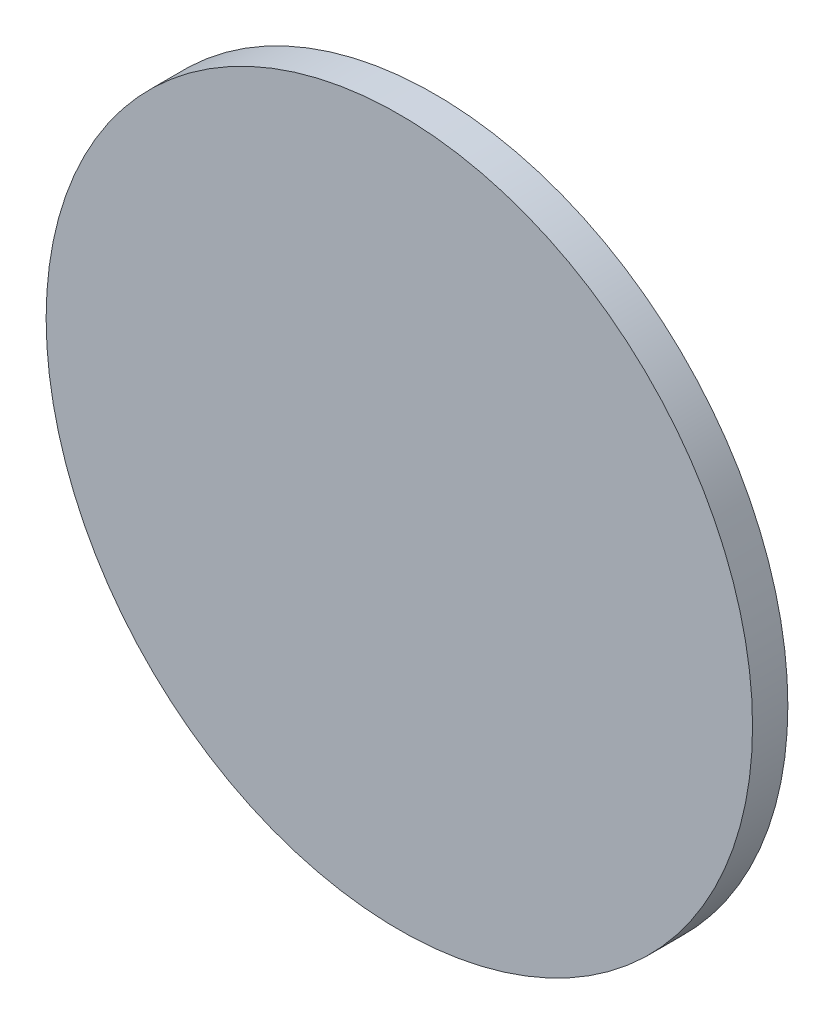
ISO-10303-21;
HEADER;
FILE_DESCRIPTION(('STEP AP214'),'2;1');
FILE_NAME('part.step','',(''),(''),'','','');
FILE_SCHEMA(('AUTOMOTIVE_DESIGN { 1 0 10303 214 1 1 1 1 }'));
ENDSEC;
DATA;
#1=APPLICATION_CONTEXT('core data for automotive mechanical design processes');
#2=APPLICATION_PROTOCOL_DEFINITION('international standard','automotive_design',2000,#1);
#3=PRODUCT_CONTEXT('',#1,'mechanical');
#4=PRODUCT('Part','Part','',(#3));
#5=PRODUCT_RELATED_PRODUCT_CATEGORY('part','',(#4));
#6=PRODUCT_DEFINITION_FORMATION('','',#4);
#7=PRODUCT_DEFINITION_CONTEXT('part definition',#1,'design');
#8=PRODUCT_DEFINITION('design','',#6,#7);
#9=PRODUCT_DEFINITION_SHAPE('','',#8);
#10=(LENGTH_UNIT() NAMED_UNIT(*) SI_UNIT(.MILLI.,.METRE.));
#11=(NAMED_UNIT(*) PLANE_ANGLE_UNIT() SI_UNIT($,.RADIAN.));
#12=(NAMED_UNIT(*) SI_UNIT($,.STERADIAN.) SOLID_ANGLE_UNIT());
#13=UNCERTAINTY_MEASURE_WITH_UNIT(LENGTH_MEASURE(1.E-05),#10,'distance_accuracy_value','');
#14=(GEOMETRIC_REPRESENTATION_CONTEXT(3) GLOBAL_UNCERTAINTY_ASSIGNED_CONTEXT((#13)) GLOBAL_UNIT_ASSIGNED_CONTEXT((#10,
#11,#12)) REPRESENTATION_CONTEXT('',''));
#15=CARTESIAN_POINT('',(0.,0.,0.));
#16=DIRECTION('',(0.,0.,1.));
#17=DIRECTION('',(1.,0.,0.));
#18=AXIS2_PLACEMENT_3D('',#15,#16,#17);
#19=CARTESIAN_POINT('',(0.,0.,0.2));
#20=DIRECTION('',(0.,0.,-1.));
#21=DIRECTION('',(-1.,0.,0.));
#22=AXIS2_PLACEMENT_3D('',#19,#20,#21);
#23=CYLINDRICAL_SURFACE('',#22,2.);
#24=CARTESIAN_POINT('',(0.,0.,0.2));
#25=DIRECTION('',(0.,0.,1.));
#26=DIRECTION('',(1.,0.,0.));
#27=AXIS2_PLACEMENT_3D('',#24,#25,#26);
#28=CIRCLE('',#27,2.);
#29=CARTESIAN_POINT('',(2.,0.,0.2));
#30=VERTEX_POINT('',#29);
#31=EDGE_CURVE('E10',#30,#30,#28,.T.);
#32=ORIENTED_EDGE('',*,*,#31,.F.);
#33=EDGE_LOOP('',(#32));
#34=FACE_BOUND('',#33,.T.);
#35=CARTESIAN_POINT('',(0.,0.,0.));
#36=DIRECTION('',(0.,0.,1.));
#37=DIRECTION('',(1.,0.,0.));
#38=AXIS2_PLACEMENT_3D('',#35,#36,#37);
#39=CIRCLE('',#38,2.);
#40=CARTESIAN_POINT('',(2.,0.,0.));
#41=VERTEX_POINT('',#40);
#42=EDGE_CURVE('E37',#41,#41,#39,.T.);
#43=ORIENTED_EDGE('',*,*,#42,.T.);
#44=EDGE_LOOP('',(#43));
#45=FACE_BOUND('',#44,.T.);
#46=ADVANCED_FACE('F34',(#34,#45),#23,.T.);
#47=CARTESIAN_POINT('',(0.,0.,0.2));
#48=DIRECTION('',(0.,0.,1.));
#49=DIRECTION('',(1.,0.,0.));
#50=AXIS2_PLACEMENT_3D('',#47,#48,#49);
#51=PLANE('',#50);
#52=ORIENTED_EDGE('',*,*,#31,.T.);
#53=EDGE_LOOP('',(#52));
#54=FACE_BOUND('',#53,.T.);
#55=ADVANCED_FACE('F49',(#54),#51,.T.);
#56=CARTESIAN_POINT('',(0.,0.,0.));
#57=DIRECTION('',(0.,0.,1.));
#58=DIRECTION('',(1.,0.,0.));
#59=AXIS2_PLACEMENT_3D('',#56,#57,#58);
#60=PLANE('',#59);
#61=ORIENTED_EDGE('',*,*,#42,.F.);
#62=EDGE_LOOP('',(#61));
#63=FACE_BOUND('',#62,.T.);
#64=ADVANCED_FACE('F47',(#63),#60,.F.);
#65=CLOSED_SHELL('',(#46,#55,#64));
#66=MANIFOLD_SOLID_BREP('B2',#65);
#67=ADVANCED_BREP_SHAPE_REPRESENTATION('',(#18,#66),#14);
#68=SHAPE_DEFINITION_REPRESENTATION(#9,#67);
ENDSEC;
END-ISO-10303-21;
